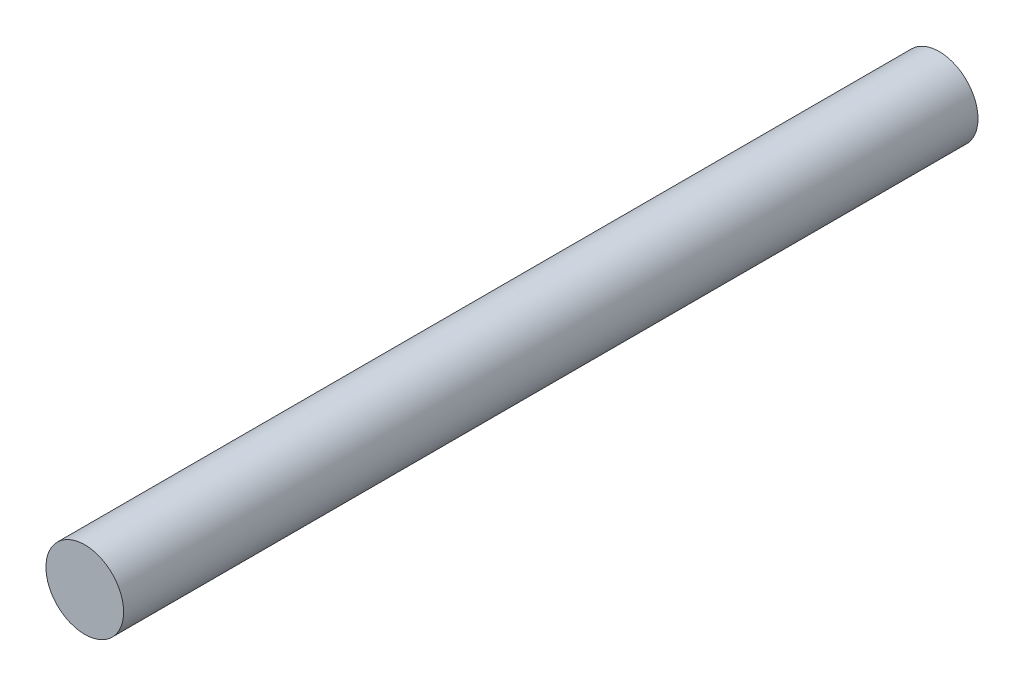
ISO-10303-21;
HEADER;
FILE_DESCRIPTION(('STEP AP214'),'2;1');
FILE_NAME('part.step','',(''),(''),'','','');
FILE_SCHEMA(('AUTOMOTIVE_DESIGN { 1 0 10303 214 1 1 1 1 }'));
ENDSEC;
DATA;
#1=APPLICATION_CONTEXT('core data for automotive mechanical design processes');
#2=APPLICATION_PROTOCOL_DEFINITION('international standard','automotive_design',2000,#1);
#3=PRODUCT_CONTEXT('',#1,'mechanical');
#4=PRODUCT('Part','Part','',(#3));
#5=PRODUCT_RELATED_PRODUCT_CATEGORY('part','',(#4));
#6=PRODUCT_DEFINITION_FORMATION('','',#4);
#7=PRODUCT_DEFINITION_CONTEXT('part definition',#1,'design');
#8=PRODUCT_DEFINITION('design','',#6,#7);
#9=PRODUCT_DEFINITION_SHAPE('','',#8);
#10=(LENGTH_UNIT() NAMED_UNIT(*) SI_UNIT(.MILLI.,.METRE.));
#11=(NAMED_UNIT(*) PLANE_ANGLE_UNIT() SI_UNIT($,.RADIAN.));
#12=(NAMED_UNIT(*) SI_UNIT($,.STERADIAN.) SOLID_ANGLE_UNIT());
#13=UNCERTAINTY_MEASURE_WITH_UNIT(LENGTH_MEASURE(1.E-05),#10,'distance_accuracy_value','');
#14=(GEOMETRIC_REPRESENTATION_CONTEXT(3) GLOBAL_UNCERTAINTY_ASSIGNED_CONTEXT((#13)) GLOBAL_UNIT_ASSIGNED_CONTEXT((#10,
#11,#12)) REPRESENTATION_CONTEXT('',''));
#15=CARTESIAN_POINT('',(0.,0.,0.));
#16=DIRECTION('',(0.,0.,1.));
#17=DIRECTION('',(1.,0.,0.));
#18=AXIS2_PLACEMENT_3D('',#15,#16,#17);
#19=CARTESIAN_POINT('',(0.,0.,69.85));
#20=DIRECTION('',(0.,0.,-1.));
#21=DIRECTION('',(-1.,0.,0.));
#22=AXIS2_PLACEMENT_3D('',#19,#20,#21);
#23=CYLINDRICAL_SURFACE('',#22,3.175);
#24=CARTESIAN_POINT('',(0.,0.,69.85));
#25=DIRECTION('',(0.,0.,1.));
#26=DIRECTION('',(1.,0.,0.));
#27=AXIS2_PLACEMENT_3D('',#24,#25,#26);
#28=CIRCLE('',#27,3.175);
#29=CARTESIAN_POINT('',(3.175,0.,69.85));
#30=VERTEX_POINT('',#29);
#31=EDGE_CURVE('E10',#30,#30,#28,.T.);
#32=ORIENTED_EDGE('',*,*,#31,.F.);
#33=EDGE_LOOP('',(#32));
#34=FACE_BOUND('',#33,.T.);
#35=CARTESIAN_POINT('',(0.,0.,0.));
#36=DIRECTION('',(0.,0.,1.));
#37=DIRECTION('',(1.,0.,0.));
#38=AXIS2_PLACEMENT_3D('',#35,#36,#37);
#39=CIRCLE('',#38,3.175);
#40=CARTESIAN_POINT('',(3.175,0.,0.));
#41=VERTEX_POINT('',#40);
#42=EDGE_CURVE('E38',#41,#41,#39,.T.);
#43=ORIENTED_EDGE('',*,*,#42,.T.);
#44=EDGE_LOOP('',(#43));
#45=FACE_BOUND('',#44,.T.);
#46=ADVANCED_FACE('F35',(#34,#45),#23,.T.);
#47=CARTESIAN_POINT('',(0.,0.,69.85));
#48=DIRECTION('',(0.,0.,1.));
#49=DIRECTION('',(1.,0.,0.));
#50=AXIS2_PLACEMENT_3D('',#47,#48,#49);
#51=PLANE('',#50);
#52=ORIENTED_EDGE('',*,*,#31,.T.);
#53=EDGE_LOOP('',(#52));
#54=FACE_BOUND('',#53,.T.);
#55=ADVANCED_FACE('F52',(#54),#51,.T.);
#56=CARTESIAN_POINT('',(0.,0.,0.));
#57=DIRECTION('',(0.,0.,1.));
#58=DIRECTION('',(1.,0.,0.));
#59=AXIS2_PLACEMENT_3D('',#56,#57,#58);
#60=PLANE('',#59);
#61=ORIENTED_EDGE('',*,*,#42,.F.);
#62=EDGE_LOOP('',(#61));
#63=FACE_BOUND('',#62,.T.);
#64=ADVANCED_FACE('F50',(#63),#60,.F.);
#65=CLOSED_SHELL('',(#46,#55,#64));
#66=MANIFOLD_SOLID_BREP('B2',#65);
#67=ADVANCED_BREP_SHAPE_REPRESENTATION('',(#18,#66),#14);
#68=SHAPE_DEFINITION_REPRESENTATION(#9,#67);
ENDSEC;
END-ISO-10303-21;
